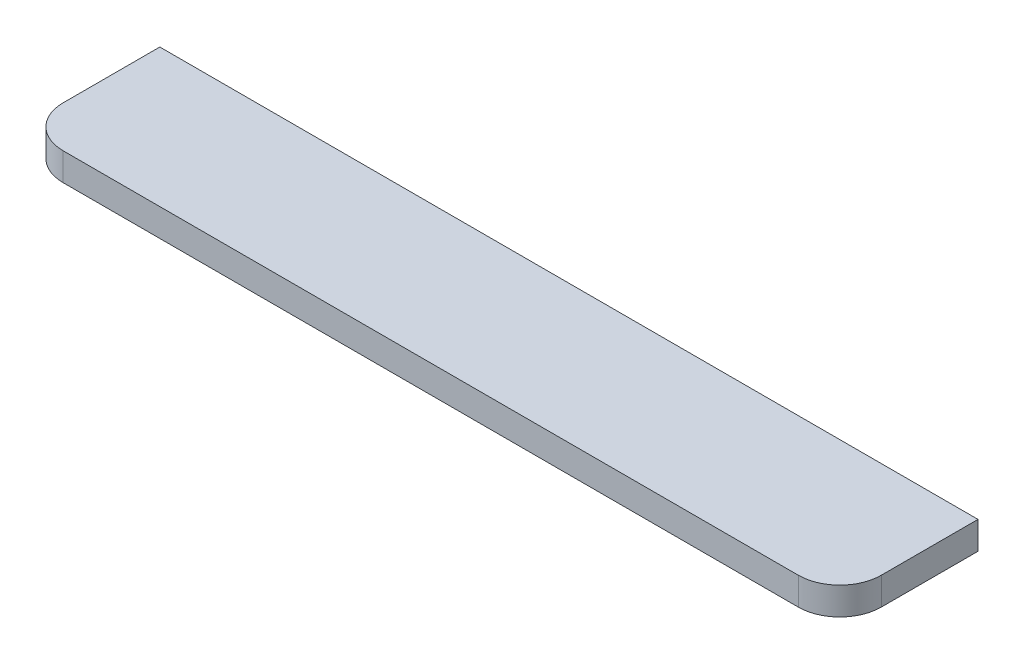
ISO-10303-21;
HEADER;
FILE_DESCRIPTION(('STEP AP214'),'2;1');
FILE_NAME('part.step','',(''),(''),'','','');
FILE_SCHEMA(('AUTOMOTIVE_DESIGN { 1 0 10303 214 1 1 1 1 }'));
ENDSEC;
DATA;
#1=APPLICATION_CONTEXT('core data for automotive mechanical design processes');
#2=APPLICATION_PROTOCOL_DEFINITION('international standard','automotive_design',2000,#1);
#3=PRODUCT_CONTEXT('',#1,'mechanical');
#4=PRODUCT('Part','Part','',(#3));
#5=PRODUCT_RELATED_PRODUCT_CATEGORY('part','',(#4));
#6=PRODUCT_DEFINITION_FORMATION('','',#4);
#7=PRODUCT_DEFINITION_CONTEXT('part definition',#1,'design');
#8=PRODUCT_DEFINITION('design','',#6,#7);
#9=PRODUCT_DEFINITION_SHAPE('','',#8);
#10=(LENGTH_UNIT() NAMED_UNIT(*) SI_UNIT(.MILLI.,.METRE.));
#11=(NAMED_UNIT(*) PLANE_ANGLE_UNIT() SI_UNIT($,.RADIAN.));
#12=(NAMED_UNIT(*) SI_UNIT($,.STERADIAN.) SOLID_ANGLE_UNIT());
#13=UNCERTAINTY_MEASURE_WITH_UNIT(LENGTH_MEASURE(1.E-05),#10,'distance_accuracy_value','');
#14=(GEOMETRIC_REPRESENTATION_CONTEXT(3) GLOBAL_UNCERTAINTY_ASSIGNED_CONTEXT((#13)) GLOBAL_UNIT_ASSIGNED_CONTEXT((#10,
#11,#12)) REPRESENTATION_CONTEXT('',''));
#15=CARTESIAN_POINT('',(0.,0.,0.));
#16=DIRECTION('',(0.,0.,1.));
#17=DIRECTION('',(1.,0.,0.));
#18=AXIS2_PLACEMENT_3D('',#15,#16,#17);
#19=CARTESIAN_POINT('',(-148.,10.,-24.9999999999999));
#20=DIRECTION('',(1.,0.,0.));
#21=DIRECTION('',(0.,0.,-1.));
#22=AXIS2_PLACEMENT_3D('',#19,#20,#21);
#23=PLANE('',#22);
#24=DIRECTION('',(0.,0.,1.));
#25=VECTOR('',#24,1.);
#26=CARTESIAN_POINT('',(-148.,0.,-24.9999999999999));
#27=LINE('',#26,#25);
#28=CARTESIAN_POINT('',(-148.,0.,-24.9999999999999));
#29=VERTEX_POINT('',#28);
#30=CARTESIAN_POINT('',(-148.,0.,9.99999999999989));
#31=VERTEX_POINT('',#30);
#32=EDGE_CURVE('E126',#29,#31,#27,.T.);
#33=ORIENTED_EDGE('',*,*,#32,.T.);
#34=DIRECTION('',(0.,-1.,0.));
#35=VECTOR('',#34,1.);
#36=CARTESIAN_POINT('',(-148.,10.,9.99999999999989));
#37=LINE('',#36,#35);
#38=CARTESIAN_POINT('',(-148.,10.,9.99999999999989));
#39=VERTEX_POINT('',#38);
#40=EDGE_CURVE('E13',#39,#31,#37,.T.);
#41=ORIENTED_EDGE('',*,*,#40,.F.);
#42=DIRECTION('',(0.,0.,1.));
#43=VECTOR('',#42,1.);
#44=CARTESIAN_POINT('',(-148.,10.,-24.9999999999999));
#45=LINE('',#44,#43);
#46=CARTESIAN_POINT('',(-148.,10.,-24.9999999999999));
#47=VERTEX_POINT('',#46);
#48=EDGE_CURVE('E138',#47,#39,#45,.T.);
#49=ORIENTED_EDGE('',*,*,#48,.F.);
#50=DIRECTION('',(0.,-1.,0.));
#51=VECTOR('',#50,1.);
#52=CARTESIAN_POINT('',(-148.,10.,-24.9999999999999));
#53=LINE('',#52,#51);
#54=EDGE_CURVE('E57',#47,#29,#53,.T.);
#55=ORIENTED_EDGE('',*,*,#54,.T.);
#56=EDGE_LOOP('',(#33,#41,#49,#55));
#57=FACE_BOUND('',#56,.T.);
#58=ADVANCED_FACE('F41',(#57),#23,.F.);
#59=CARTESIAN_POINT('',(-133.,10.,10.));
#60=DIRECTION('',(0.,-1.,0.));
#61=DIRECTION('',(0.,0.,-1.));
#62=AXIS2_PLACEMENT_3D('',#59,#60,#61);
#63=CYLINDRICAL_SURFACE('',#62,15.);
#64=CARTESIAN_POINT('',(-133.,0.,10.));
#65=DIRECTION('',(0.,1.,0.));
#66=DIRECTION('',(0.,0.,1.));
#67=AXIS2_PLACEMENT_3D('',#64,#65,#66);
#68=CIRCLE('',#67,15.);
#69=CARTESIAN_POINT('',(-133.,0.,25.));
#70=VERTEX_POINT('',#69);
#71=EDGE_CURVE('E128',#31,#70,#68,.T.);
#72=ORIENTED_EDGE('',*,*,#71,.T.);
#73=DIRECTION('',(0.,-1.,0.));
#74=VECTOR('',#73,1.);
#75=CARTESIAN_POINT('',(-133.,10.,25.));
#76=LINE('',#75,#74);
#77=CARTESIAN_POINT('',(-133.,10.,25.));
#78=VERTEX_POINT('',#77);
#79=EDGE_CURVE('E49',#78,#70,#76,.T.);
#80=ORIENTED_EDGE('',*,*,#79,.F.);
#81=CARTESIAN_POINT('',(-133.,10.,10.));
#82=DIRECTION('',(0.,1.,0.));
#83=DIRECTION('',(0.,0.,1.));
#84=AXIS2_PLACEMENT_3D('',#81,#82,#83);
#85=CIRCLE('',#84,15.);
#86=EDGE_CURVE('E89',#39,#78,#85,.T.);
#87=ORIENTED_EDGE('',*,*,#86,.F.);
#88=ORIENTED_EDGE('',*,*,#40,.T.);
#89=EDGE_LOOP('',(#72,#80,#87,#88));
#90=FACE_BOUND('',#89,.T.);
#91=ADVANCED_FACE('F158',(#90),#63,.T.);
#92=CARTESIAN_POINT('',(-133.,10.,25.));
#93=DIRECTION('',(0.,0.,-1.));
#94=DIRECTION('',(-1.,0.,0.));
#95=AXIS2_PLACEMENT_3D('',#92,#93,#94);
#96=PLANE('',#95);
#97=DIRECTION('',(1.,0.,0.));
#98=VECTOR('',#97,1.);
#99=CARTESIAN_POINT('',(-133.,0.,25.));
#100=LINE('',#99,#98);
#101=CARTESIAN_POINT('',(133.,0.,25.));
#102=VERTEX_POINT('',#101);
#103=EDGE_CURVE('E130',#70,#102,#100,.T.);
#104=ORIENTED_EDGE('',*,*,#103,.T.);
#105=DIRECTION('',(0.,-1.,0.));
#106=VECTOR('',#105,1.);
#107=CARTESIAN_POINT('',(133.,10.,25.));
#108=LINE('',#107,#106);
#109=CARTESIAN_POINT('',(133.,10.,25.));
#110=VERTEX_POINT('',#109);
#111=EDGE_CURVE('E118',#110,#102,#108,.T.);
#112=ORIENTED_EDGE('',*,*,#111,.F.);
#113=DIRECTION('',(1.,0.,0.));
#114=VECTOR('',#113,1.);
#115=CARTESIAN_POINT('',(-133.,10.,25.));
#116=LINE('',#115,#114);
#117=EDGE_CURVE('E106',#78,#110,#116,.T.);
#118=ORIENTED_EDGE('',*,*,#117,.F.);
#119=ORIENTED_EDGE('',*,*,#79,.T.);
#120=EDGE_LOOP('',(#104,#112,#118,#119));
#121=FACE_BOUND('',#120,.T.);
#122=ADVANCED_FACE('F144',(#121),#96,.F.);
#123=CARTESIAN_POINT('',(133.,10.,10.));
#124=DIRECTION('',(0.,-1.,0.));
#125=DIRECTION('',(0.,0.,-1.));
#126=AXIS2_PLACEMENT_3D('',#123,#124,#125);
#127=CYLINDRICAL_SURFACE('',#126,15.);
#128=CARTESIAN_POINT('',(133.,0.,10.));
#129=DIRECTION('',(0.,1.,0.));
#130=DIRECTION('',(0.,0.,1.));
#131=AXIS2_PLACEMENT_3D('',#128,#129,#130);
#132=CIRCLE('',#131,15.);
#133=CARTESIAN_POINT('',(148.,0.,9.9999999999999));
#134=VERTEX_POINT('',#133);
#135=EDGE_CURVE('E115',#102,#134,#132,.T.);
#136=ORIENTED_EDGE('',*,*,#135,.T.);
#137=DIRECTION('',(0.,-1.,0.));
#138=VECTOR('',#137,1.);
#139=CARTESIAN_POINT('',(148.,10.,9.9999999999999));
#140=LINE('',#139,#138);
#141=CARTESIAN_POINT('',(148.,10.,9.9999999999999));
#142=VERTEX_POINT('',#141);
#143=EDGE_CURVE('E112',#142,#134,#140,.T.);
#144=ORIENTED_EDGE('',*,*,#143,.F.);
#145=CARTESIAN_POINT('',(133.,10.,10.));
#146=DIRECTION('',(0.,1.,0.));
#147=DIRECTION('',(0.,0.,1.));
#148=AXIS2_PLACEMENT_3D('',#145,#146,#147);
#149=CIRCLE('',#148,15.);
#150=EDGE_CURVE('E99',#110,#142,#149,.T.);
#151=ORIENTED_EDGE('',*,*,#150,.F.);
#152=ORIENTED_EDGE('',*,*,#111,.T.);
#153=EDGE_LOOP('',(#136,#144,#151,#152));
#154=FACE_BOUND('',#153,.T.);
#155=ADVANCED_FACE('F113',(#154),#127,.T.);
#156=CARTESIAN_POINT('',(148.,10.,-24.9999999999999));
#157=DIRECTION('',(1.,0.,0.));
#158=DIRECTION('',(0.,0.,-1.));
#159=AXIS2_PLACEMENT_3D('',#156,#157,#158);
#160=PLANE('',#159);
#161=DIRECTION('',(0.,0.,1.));
#162=VECTOR('',#161,1.);
#163=CARTESIAN_POINT('',(148.,0.,-24.9999999999999));
#164=LINE('',#163,#162);
#165=CARTESIAN_POINT('',(148.,0.,-24.9999999999999));
#166=VERTEX_POINT('',#165);
#167=EDGE_CURVE('E133',#166,#134,#164,.T.);
#168=ORIENTED_EDGE('',*,*,#167,.F.);
#169=DIRECTION('',(0.,-1.,0.));
#170=VECTOR('',#169,1.);
#171=CARTESIAN_POINT('',(148.,10.,-24.9999999999999));
#172=LINE('',#171,#170);
#173=CARTESIAN_POINT('',(148.,10.,-24.9999999999999));
#174=VERTEX_POINT('',#173);
#175=EDGE_CURVE('E77',#174,#166,#172,.T.);
#176=ORIENTED_EDGE('',*,*,#175,.F.);
#177=DIRECTION('',(0.,0.,1.));
#178=VECTOR('',#177,1.);
#179=CARTESIAN_POINT('',(148.,10.,-24.9999999999999));
#180=LINE('',#179,#178);
#181=EDGE_CURVE('E104',#174,#142,#180,.T.);
#182=ORIENTED_EDGE('',*,*,#181,.T.);
#183=ORIENTED_EDGE('',*,*,#143,.T.);
#184=EDGE_LOOP('',(#168,#176,#182,#183));
#185=FACE_BOUND('',#184,.T.);
#186=ADVANCED_FACE('F120',(#185),#160,.T.);
#187=CARTESIAN_POINT('',(-148.,10.,-24.9999999999999));
#188=DIRECTION('',(0.,0.,-1.));
#189=DIRECTION('',(-1.,0.,0.));
#190=AXIS2_PLACEMENT_3D('',#187,#188,#189);
#191=PLANE('',#190);
#192=DIRECTION('',(1.,0.,0.));
#193=VECTOR('',#192,1.);
#194=CARTESIAN_POINT('',(-148.,0.,-24.9999999999999));
#195=LINE('',#194,#193);
#196=EDGE_CURVE('E135',#29,#166,#195,.T.);
#197=ORIENTED_EDGE('',*,*,#196,.F.);
#198=ORIENTED_EDGE('',*,*,#54,.F.);
#199=DIRECTION('',(1.,0.,0.));
#200=VECTOR('',#199,1.);
#201=CARTESIAN_POINT('',(-148.,10.,-24.9999999999999));
#202=LINE('',#201,#200);
#203=EDGE_CURVE('E121',#47,#174,#202,.T.);
#204=ORIENTED_EDGE('',*,*,#203,.T.);
#205=ORIENTED_EDGE('',*,*,#175,.T.);
#206=EDGE_LOOP('',(#197,#198,#204,#205));
#207=FACE_BOUND('',#206,.T.);
#208=ADVANCED_FACE('F147',(#207),#191,.T.);
#209=CARTESIAN_POINT('',(-133.,10.,10.));
#210=DIRECTION('',(0.,1.,0.));
#211=DIRECTION('',(0.,0.,1.));
#212=AXIS2_PLACEMENT_3D('',#209,#210,#211);
#213=PLANE('',#212);
#214=ORIENTED_EDGE('',*,*,#48,.T.);
#215=ORIENTED_EDGE('',*,*,#86,.T.);
#216=ORIENTED_EDGE('',*,*,#117,.T.);
#217=ORIENTED_EDGE('',*,*,#150,.T.);
#218=ORIENTED_EDGE('',*,*,#181,.F.);
#219=ORIENTED_EDGE('',*,*,#203,.F.);
#220=EDGE_LOOP('',(#214,#215,#216,#217,#218,#219));
#221=FACE_BOUND('',#220,.T.);
#222=ADVANCED_FACE('F101',(#221),#213,.T.);
#223=CARTESIAN_POINT('',(-133.,0.,10.));
#224=DIRECTION('',(0.,1.,0.));
#225=DIRECTION('',(0.,0.,1.));
#226=AXIS2_PLACEMENT_3D('',#223,#224,#225);
#227=PLANE('',#226);
#228=ORIENTED_EDGE('',*,*,#32,.F.);
#229=ORIENTED_EDGE('',*,*,#196,.T.);
#230=ORIENTED_EDGE('',*,*,#167,.T.);
#231=ORIENTED_EDGE('',*,*,#135,.F.);
#232=ORIENTED_EDGE('',*,*,#103,.F.);
#233=ORIENTED_EDGE('',*,*,#71,.F.);
#234=EDGE_LOOP('',(#228,#229,#230,#231,#232,#233));
#235=FACE_BOUND('',#234,.T.);
#236=ADVANCED_FACE('F146',(#235),#227,.F.);
#237=CLOSED_SHELL('',(#58,#91,#122,#155,#186,#208,#222,#236));
#238=MANIFOLD_SOLID_BREP('B2',#237);
#239=ADVANCED_BREP_SHAPE_REPRESENTATION('',(#18,#238),#14);
#240=SHAPE_DEFINITION_REPRESENTATION(#9,#239);
ENDSEC;
END-ISO-10303-21;
